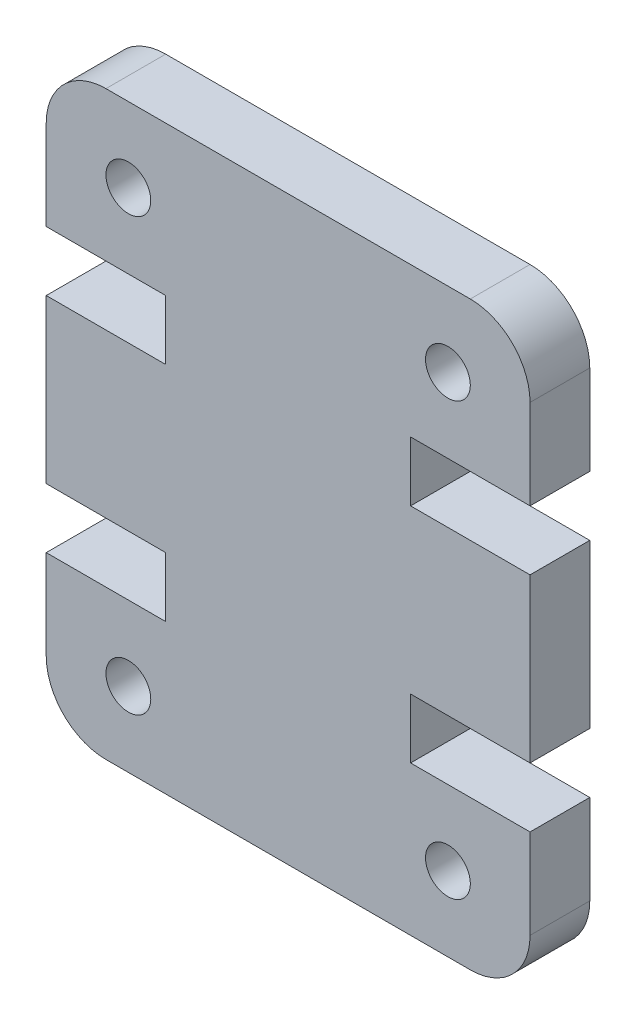
ISO-10303-21;
HEADER;
FILE_DESCRIPTION(('STEP AP214'),'2;1');
FILE_NAME('part.step','',(''),(''),'','','');
FILE_SCHEMA(('AUTOMOTIVE_DESIGN { 1 0 10303 214 1 1 1 1 }'));
ENDSEC;
DATA;
#1=APPLICATION_CONTEXT('core data for automotive mechanical design processes');
#2=APPLICATION_PROTOCOL_DEFINITION('international standard','automotive_design',2000,#1);
#3=PRODUCT_CONTEXT('',#1,'mechanical');
#4=PRODUCT('Part','Part','',(#3));
#5=PRODUCT_RELATED_PRODUCT_CATEGORY('part','',(#4));
#6=PRODUCT_DEFINITION_FORMATION('','',#4);
#7=PRODUCT_DEFINITION_CONTEXT('part definition',#1,'design');
#8=PRODUCT_DEFINITION('design','',#6,#7);
#9=PRODUCT_DEFINITION_SHAPE('','',#8);
#10=(LENGTH_UNIT() NAMED_UNIT(*) SI_UNIT(.MILLI.,.METRE.));
#11=(NAMED_UNIT(*) PLANE_ANGLE_UNIT() SI_UNIT($,.RADIAN.));
#12=(NAMED_UNIT(*) SI_UNIT($,.STERADIAN.) SOLID_ANGLE_UNIT());
#13=UNCERTAINTY_MEASURE_WITH_UNIT(LENGTH_MEASURE(1.E-05),#10,'distance_accuracy_value','');
#14=(GEOMETRIC_REPRESENTATION_CONTEXT(3) GLOBAL_UNCERTAINTY_ASSIGNED_CONTEXT((#13)) GLOBAL_UNIT_ASSIGNED_CONTEXT((#10,
#11,#12)) REPRESENTATION_CONTEXT('',''));
#15=CARTESIAN_POINT('',(0.,0.,0.));
#16=DIRECTION('',(0.,0.,1.));
#17=DIRECTION('',(1.,0.,0.));
#18=AXIS2_PLACEMENT_3D('',#15,#16,#17);
#19=CARTESIAN_POINT('',(14.1999999999999,2.00000000000013,2.));
#20=DIRECTION('',(0.,0.,-1.));
#21=DIRECTION('',(-1.,0.,0.));
#22=AXIS2_PLACEMENT_3D('',#19,#20,#21);
#23=PLANE('',#22);
#24=CARTESIAN_POINT('',(2.75000000000449,16.9549999999999,2.));
#25=DIRECTION('',(0.,0.,1.));
#26=DIRECTION('',(-1.,0.,0.));
#27=AXIS2_PLACEMENT_3D('',#24,#25,#26);
#28=CIRCLE('',#27,0.75);
#29=CARTESIAN_POINT('',(2.00000000000449,16.9549999999999,2.));
#30=VERTEX_POINT('',#29);
#31=EDGE_CURVE('E448',#30,#30,#28,.T.);
#32=ORIENTED_EDGE('',*,*,#31,.F.);
#33=EDGE_LOOP('',(#32));
#34=FACE_BOUND('',#33,.T.);
#35=CARTESIAN_POINT('',(13.4499999999955,2.50000000000005,2.));
#36=DIRECTION('',(0.,0.,1.));
#37=DIRECTION('',(-1.,0.,0.));
#38=AXIS2_PLACEMENT_3D('',#35,#36,#37);
#39=CIRCLE('',#38,0.750000000000004);
#40=CARTESIAN_POINT('',(12.6999999999955,2.50000000000005,2.));
#41=VERTEX_POINT('',#40);
#42=EDGE_CURVE('E230',#41,#41,#39,.T.);
#43=ORIENTED_EDGE('',*,*,#42,.F.);
#44=EDGE_LOOP('',(#43));
#45=FACE_BOUND('',#44,.T.);
#46=CARTESIAN_POINT('',(14.1999999999999,2.00000000000013,2.));
#47=DIRECTION('',(0.,0.,1.));
#48=DIRECTION('',(-1.,0.,0.));
#49=AXIS2_PLACEMENT_3D('',#46,#47,#48);
#50=CIRCLE('',#49,2.00000000000013);
#51=CARTESIAN_POINT('',(14.1999999999999,0.,2.));
#52=VERTEX_POINT('',#51);
#53=CARTESIAN_POINT('',(16.2,2.00000000000013,2.));
#54=VERTEX_POINT('',#53);
#55=EDGE_CURVE('E273',#52,#54,#50,.T.);
#56=ORIENTED_EDGE('',*,*,#55,.T.);
#57=DIRECTION('',(0.,1.,0.));
#58=VECTOR('',#57,1.);
#59=CARTESIAN_POINT('',(16.2,5.00000000000021,2.));
#60=LINE('',#59,#58);
#61=CARTESIAN_POINT('',(16.2,5.00000000000021,2.));
#62=VERTEX_POINT('',#61);
#63=EDGE_CURVE('E141',#54,#62,#60,.T.);
#64=ORIENTED_EDGE('',*,*,#63,.T.);
#65=DIRECTION('',(-1.,0.,0.));
#66=VECTOR('',#65,1.);
#67=CARTESIAN_POINT('',(12.1999999999997,5.00000000000021,2.));
#68=LINE('',#67,#66);
#69=CARTESIAN_POINT('',(12.1999999999997,5.00000000000021,2.));
#70=VERTEX_POINT('',#69);
#71=EDGE_CURVE('E336',#62,#70,#68,.T.);
#72=ORIENTED_EDGE('',*,*,#71,.T.);
#73=DIRECTION('',(0.,1.,0.));
#74=VECTOR('',#73,1.);
#75=CARTESIAN_POINT('',(12.1999999999997,7.00000000000034,2.));
#76=LINE('',#75,#74);
#77=CARTESIAN_POINT('',(12.1999999999997,7.00000000000034,2.));
#78=VERTEX_POINT('',#77);
#79=EDGE_CURVE('E355',#70,#78,#76,.T.);
#80=ORIENTED_EDGE('',*,*,#79,.T.);
#81=DIRECTION('',(1.,0.,0.));
#82=VECTOR('',#81,1.);
#83=CARTESIAN_POINT('',(16.2,7.00000000000034,2.));
#84=LINE('',#83,#82);
#85=CARTESIAN_POINT('',(16.2,7.00000000000034,2.));
#86=VERTEX_POINT('',#85);
#87=EDGE_CURVE('E352',#78,#86,#84,.T.);
#88=ORIENTED_EDGE('',*,*,#87,.T.);
#89=DIRECTION('',(0.,1.,0.));
#90=VECTOR('',#89,1.);
#91=CARTESIAN_POINT('',(16.2,7.00000000000034,2.));
#92=LINE('',#91,#90);
#93=CARTESIAN_POINT('',(16.2,12.4549999999997,2.));
#94=VERTEX_POINT('',#93);
#95=EDGE_CURVE('E354',#86,#94,#92,.T.);
#96=ORIENTED_EDGE('',*,*,#95,.T.);
#97=DIRECTION('',(-1.,0.,0.));
#98=VECTOR('',#97,1.);
#99=CARTESIAN_POINT('',(16.2,12.4549999999997,2.));
#100=LINE('',#99,#98);
#101=CARTESIAN_POINT('',(12.1999999999997,12.4549999999997,2.));
#102=VERTEX_POINT('',#101);
#103=EDGE_CURVE('E357',#94,#102,#100,.T.);
#104=ORIENTED_EDGE('',*,*,#103,.T.);
#105=DIRECTION('',(0.,1.,0.));
#106=VECTOR('',#105,1.);
#107=CARTESIAN_POINT('',(12.1999999999997,12.4549999999997,2.));
#108=LINE('',#107,#106);
#109=CARTESIAN_POINT('',(12.1999999999997,14.4549999999998,2.));
#110=VERTEX_POINT('',#109);
#111=EDGE_CURVE('E363',#102,#110,#108,.T.);
#112=ORIENTED_EDGE('',*,*,#111,.T.);
#113=DIRECTION('',(1.,0.,0.));
#114=VECTOR('',#113,1.);
#115=CARTESIAN_POINT('',(12.1999999999997,14.4549999999998,2.));
#116=LINE('',#115,#114);
#117=CARTESIAN_POINT('',(16.2,14.4549999999998,2.));
#118=VERTEX_POINT('',#117);
#119=EDGE_CURVE('E365',#110,#118,#116,.T.);
#120=ORIENTED_EDGE('',*,*,#119,.T.);
#121=DIRECTION('',(0.,1.,0.));
#122=VECTOR('',#121,1.);
#123=CARTESIAN_POINT('',(16.2,14.4549999999998,2.));
#124=LINE('',#123,#122);
#125=CARTESIAN_POINT('',(16.2,17.4549999999999,2.));
#126=VERTEX_POINT('',#125);
#127=EDGE_CURVE('E367',#118,#126,#124,.T.);
#128=ORIENTED_EDGE('',*,*,#127,.T.);
#129=CARTESIAN_POINT('',(14.1999999999999,17.4549999999999,2.));
#130=DIRECTION('',(0.,0.,1.));
#131=DIRECTION('',(1.,0.,0.));
#132=AXIS2_PLACEMENT_3D('',#129,#130,#131);
#133=CIRCLE('',#132,2.00000000000013);
#134=CARTESIAN_POINT('',(14.1999999999999,19.455,2.));
#135=VERTEX_POINT('',#134);
#136=EDGE_CURVE('E369',#126,#135,#133,.T.);
#137=ORIENTED_EDGE('',*,*,#136,.T.);
#138=DIRECTION('',(-1.,0.,0.));
#139=VECTOR('',#138,1.);
#140=CARTESIAN_POINT('',(2.00000000000012,19.455,2.));
#141=LINE('',#140,#139);
#142=CARTESIAN_POINT('',(2.00000000000012,19.455,2.));
#143=VERTEX_POINT('',#142);
#144=EDGE_CURVE('E371',#135,#143,#141,.T.);
#145=ORIENTED_EDGE('',*,*,#144,.T.);
#146=CARTESIAN_POINT('',(2.00000000000012,17.4549999999999,2.));
#147=DIRECTION('',(0.,0.,1.));
#148=DIRECTION('',(-1.,0.,0.));
#149=AXIS2_PLACEMENT_3D('',#146,#147,#148);
#150=CIRCLE('',#149,2.00000000000013);
#151=CARTESIAN_POINT('',(0.,17.4549999999999,2.));
#152=VERTEX_POINT('',#151);
#153=EDGE_CURVE('E373',#143,#152,#150,.T.);
#154=ORIENTED_EDGE('',*,*,#153,.T.);
#155=DIRECTION('',(0.,-1.,0.));
#156=VECTOR('',#155,1.);
#157=CARTESIAN_POINT('',(0.,14.4549999999998,2.));
#158=LINE('',#157,#156);
#159=CARTESIAN_POINT('',(0.,14.4549999999998,2.));
#160=VERTEX_POINT('',#159);
#161=EDGE_CURVE('E375',#152,#160,#158,.T.);
#162=ORIENTED_EDGE('',*,*,#161,.T.);
#163=DIRECTION('',(1.,0.,0.));
#164=VECTOR('',#163,1.);
#165=CARTESIAN_POINT('',(4.00000000000025,14.4549999999998,2.));
#166=LINE('',#165,#164);
#167=CARTESIAN_POINT('',(4.00000000000025,14.4549999999998,2.));
#168=VERTEX_POINT('',#167);
#169=EDGE_CURVE('E377',#160,#168,#166,.T.);
#170=ORIENTED_EDGE('',*,*,#169,.T.);
#171=DIRECTION('',(0.,-1.,0.));
#172=VECTOR('',#171,1.);
#173=CARTESIAN_POINT('',(4.00000000000025,12.4549999999997,2.));
#174=LINE('',#173,#172);
#175=CARTESIAN_POINT('',(4.00000000000025,12.4549999999997,2.));
#176=VERTEX_POINT('',#175);
#177=EDGE_CURVE('E379',#168,#176,#174,.T.);
#178=ORIENTED_EDGE('',*,*,#177,.T.);
#179=DIRECTION('',(-1.,0.,0.));
#180=VECTOR('',#179,1.);
#181=CARTESIAN_POINT('',(0.,12.4549999999997,2.));
#182=LINE('',#181,#180);
#183=CARTESIAN_POINT('',(0.,12.4549999999997,2.));
#184=VERTEX_POINT('',#183);
#185=EDGE_CURVE('E381',#176,#184,#182,.T.);
#186=ORIENTED_EDGE('',*,*,#185,.T.);
#187=DIRECTION('',(0.,-1.,0.));
#188=VECTOR('',#187,1.);
#189=CARTESIAN_POINT('',(0.,7.00000000000034,2.));
#190=LINE('',#189,#188);
#191=CARTESIAN_POINT('',(0.,7.00000000000034,2.));
#192=VERTEX_POINT('',#191);
#193=EDGE_CURVE('E383',#184,#192,#190,.T.);
#194=ORIENTED_EDGE('',*,*,#193,.T.);
#195=DIRECTION('',(1.,0.,0.));
#196=VECTOR('',#195,1.);
#197=CARTESIAN_POINT('',(0.,7.00000000000034,2.));
#198=LINE('',#197,#196);
#199=CARTESIAN_POINT('',(4.00000000000016,7.00000000000031,2.));
#200=VERTEX_POINT('',#199);
#201=EDGE_CURVE('E385',#192,#200,#198,.T.);
#202=ORIENTED_EDGE('',*,*,#201,.T.);
#203=DIRECTION('',(0.,-1.,0.));
#204=VECTOR('',#203,1.);
#205=CARTESIAN_POINT('',(4.00000000000016,7.00000000000031,2.));
#206=LINE('',#205,#204);
#207=CARTESIAN_POINT('',(4.00000000000016,5.00000000000021,2.));
#208=VERTEX_POINT('',#207);
#209=EDGE_CURVE('E387',#200,#208,#206,.T.);
#210=ORIENTED_EDGE('',*,*,#209,.T.);
#211=DIRECTION('',(-1.,0.,0.));
#212=VECTOR('',#211,1.);
#213=CARTESIAN_POINT('',(4.00000000000016,5.00000000000021,2.));
#214=LINE('',#213,#212);
#215=CARTESIAN_POINT('',(0.,5.00000000000021,2.));
#216=VERTEX_POINT('',#215);
#217=EDGE_CURVE('E208',#208,#216,#214,.T.);
#218=ORIENTED_EDGE('',*,*,#217,.T.);
#219=DIRECTION('',(0.,-1.,0.));
#220=VECTOR('',#219,1.);
#221=CARTESIAN_POINT('',(0.,5.00000000000021,2.));
#222=LINE('',#221,#220);
#223=CARTESIAN_POINT('',(0.,2.0000000000001,2.));
#224=VERTEX_POINT('',#223);
#225=EDGE_CURVE('E202',#216,#224,#222,.T.);
#226=ORIENTED_EDGE('',*,*,#225,.T.);
#227=CARTESIAN_POINT('',(2.00000000000007,2.00000000000013,2.));
#228=DIRECTION('',(0.,0.,1.));
#229=DIRECTION('',(1.,0.,0.));
#230=AXIS2_PLACEMENT_3D('',#227,#228,#229);
#231=CIRCLE('',#230,2.0000000000001);
#232=CARTESIAN_POINT('',(2.00000000000008,0.,2.));
#233=VERTEX_POINT('',#232);
#234=EDGE_CURVE('E206',#224,#233,#231,.T.);
#235=ORIENTED_EDGE('',*,*,#234,.T.);
#236=DIRECTION('',(1.,0.,0.));
#237=VECTOR('',#236,1.);
#238=CARTESIAN_POINT('',(2.00000000000008,0.,2.));
#239=LINE('',#238,#237);
#240=EDGE_CURVE('E50',#233,#52,#239,.T.);
#241=ORIENTED_EDGE('',*,*,#240,.T.);
#242=EDGE_LOOP('',(#56,#64,#72,#80,#88,#96,#104,#112,#120,#128,#137,#145,#154,#162,#170,#178,
#186,#194,#202,#210,#218,#226,#235,#241));
#243=FACE_BOUND('',#242,.T.);
#244=CARTESIAN_POINT('',(2.7500000000045,2.50000000000004,2.));
#245=DIRECTION('',(0.,0.,1.));
#246=DIRECTION('',(1.,0.,0.));
#247=AXIS2_PLACEMENT_3D('',#244,#245,#246);
#248=CIRCLE('',#247,0.75);
#249=CARTESIAN_POINT('',(3.5000000000045,2.50000000000004,2.));
#250=VERTEX_POINT('',#249);
#251=EDGE_CURVE('E454',#250,#250,#248,.T.);
#252=ORIENTED_EDGE('',*,*,#251,.F.);
#253=EDGE_LOOP('',(#252));
#254=FACE_BOUND('',#253,.T.);
#255=CARTESIAN_POINT('',(13.4499999999955,16.9549999999999,2.));
#256=DIRECTION('',(0.,0.,1.));
#257=DIRECTION('',(1.,0.,0.));
#258=AXIS2_PLACEMENT_3D('',#255,#256,#257);
#259=CIRCLE('',#258,0.750000000000004);
#260=CARTESIAN_POINT('',(14.1999999999955,16.9549999999999,2.));
#261=VERTEX_POINT('',#260);
#262=EDGE_CURVE('E439',#261,#261,#259,.T.);
#263=ORIENTED_EDGE('',*,*,#262,.F.);
#264=EDGE_LOOP('',(#263));
#265=FACE_BOUND('',#264,.T.);
#266=ADVANCED_FACE('F33',(#34,#45,#243,#254,#265),#23,.F.);
#267=CARTESIAN_POINT('',(14.1999999999999,2.00000000000013,0.));
#268=DIRECTION('',(0.,0.,-1.));
#269=DIRECTION('',(-1.,0.,0.));
#270=AXIS2_PLACEMENT_3D('',#267,#268,#269);
#271=PLANE('',#270);
#272=CARTESIAN_POINT('',(2.75000000000449,16.9549999999999,0.));
#273=DIRECTION('',(0.,0.,1.));
#274=DIRECTION('',(-1.,0.,0.));
#275=AXIS2_PLACEMENT_3D('',#272,#273,#274);
#276=CIRCLE('',#275,0.75);
#277=CARTESIAN_POINT('',(2.00000000000449,16.9549999999999,0.));
#278=VERTEX_POINT('',#277);
#279=EDGE_CURVE('E445',#278,#278,#276,.T.);
#280=ORIENTED_EDGE('',*,*,#279,.T.);
#281=EDGE_LOOP('',(#280));
#282=FACE_BOUND('',#281,.T.);
#283=CARTESIAN_POINT('',(13.4499999999955,2.50000000000005,0.));
#284=DIRECTION('',(0.,0.,1.));
#285=DIRECTION('',(-1.,0.,0.));
#286=AXIS2_PLACEMENT_3D('',#283,#284,#285);
#287=CIRCLE('',#286,0.750000000000004);
#288=CARTESIAN_POINT('',(12.6999999999955,2.50000000000005,0.));
#289=VERTEX_POINT('',#288);
#290=EDGE_CURVE('E457',#289,#289,#287,.T.);
#291=ORIENTED_EDGE('',*,*,#290,.T.);
#292=EDGE_LOOP('',(#291));
#293=FACE_BOUND('',#292,.T.);
#294=CARTESIAN_POINT('',(14.1999999999999,2.00000000000013,0.));
#295=DIRECTION('',(0.,0.,1.));
#296=DIRECTION('',(-1.,0.,0.));
#297=AXIS2_PLACEMENT_3D('',#294,#295,#296);
#298=CIRCLE('',#297,2.00000000000013);
#299=CARTESIAN_POINT('',(14.1999999999999,0.,0.));
#300=VERTEX_POINT('',#299);
#301=CARTESIAN_POINT('',(16.2,2.00000000000013,0.));
#302=VERTEX_POINT('',#301);
#303=EDGE_CURVE('E226',#300,#302,#298,.T.);
#304=ORIENTED_EDGE('',*,*,#303,.F.);
#305=DIRECTION('',(1.,0.,0.));
#306=VECTOR('',#305,1.);
#307=CARTESIAN_POINT('',(2.00000000000008,0.,0.));
#308=LINE('',#307,#306);
#309=CARTESIAN_POINT('',(2.00000000000008,0.,0.));
#310=VERTEX_POINT('',#309);
#311=EDGE_CURVE('E133',#310,#300,#308,.T.);
#312=ORIENTED_EDGE('',*,*,#311,.F.);
#313=CARTESIAN_POINT('',(2.00000000000007,2.00000000000013,0.));
#314=DIRECTION('',(0.,0.,1.));
#315=DIRECTION('',(1.,0.,0.));
#316=AXIS2_PLACEMENT_3D('',#313,#314,#315);
#317=CIRCLE('',#316,2.0000000000001);
#318=CARTESIAN_POINT('',(0.,2.0000000000001,0.));
#319=VERTEX_POINT('',#318);
#320=EDGE_CURVE('E127',#319,#310,#317,.T.);
#321=ORIENTED_EDGE('',*,*,#320,.F.);
#322=DIRECTION('',(0.,-1.,0.));
#323=VECTOR('',#322,1.);
#324=CARTESIAN_POINT('',(0.,5.00000000000021,0.));
#325=LINE('',#324,#323);
#326=CARTESIAN_POINT('',(0.,5.00000000000021,0.));
#327=VERTEX_POINT('',#326);
#328=EDGE_CURVE('E216',#327,#319,#325,.T.);
#329=ORIENTED_EDGE('',*,*,#328,.F.);
#330=DIRECTION('',(-1.,0.,0.));
#331=VECTOR('',#330,1.);
#332=CARTESIAN_POINT('',(4.00000000000016,5.00000000000021,0.));
#333=LINE('',#332,#331);
#334=CARTESIAN_POINT('',(4.00000000000016,5.00000000000021,0.));
#335=VERTEX_POINT('',#334);
#336=EDGE_CURVE('E268',#335,#327,#333,.T.);
#337=ORIENTED_EDGE('',*,*,#336,.F.);
#338=DIRECTION('',(0.,-1.,0.));
#339=VECTOR('',#338,1.);
#340=CARTESIAN_POINT('',(4.00000000000016,7.00000000000031,0.));
#341=LINE('',#340,#339);
#342=CARTESIAN_POINT('',(4.00000000000016,7.00000000000031,0.));
#343=VERTEX_POINT('',#342);
#344=EDGE_CURVE('E266',#343,#335,#341,.T.);
#345=ORIENTED_EDGE('',*,*,#344,.F.);
#346=DIRECTION('',(1.,0.,0.));
#347=VECTOR('',#346,1.);
#348=CARTESIAN_POINT('',(0.,7.00000000000034,0.));
#349=LINE('',#348,#347);
#350=CARTESIAN_POINT('',(0.,7.00000000000034,0.));
#351=VERTEX_POINT('',#350);
#352=EDGE_CURVE('E264',#351,#343,#349,.T.);
#353=ORIENTED_EDGE('',*,*,#352,.F.);
#354=DIRECTION('',(0.,-1.,0.));
#355=VECTOR('',#354,1.);
#356=CARTESIAN_POINT('',(0.,7.00000000000034,0.));
#357=LINE('',#356,#355);
#358=CARTESIAN_POINT('',(0.,12.4549999999997,0.));
#359=VERTEX_POINT('',#358);
#360=EDGE_CURVE('E262',#359,#351,#357,.T.);
#361=ORIENTED_EDGE('',*,*,#360,.F.);
#362=DIRECTION('',(-1.,0.,0.));
#363=VECTOR('',#362,1.);
#364=CARTESIAN_POINT('',(0.,12.4549999999997,0.));
#365=LINE('',#364,#363);
#366=CARTESIAN_POINT('',(4.00000000000025,12.4549999999997,0.));
#367=VERTEX_POINT('',#366);
#368=EDGE_CURVE('E260',#367,#359,#365,.T.);
#369=ORIENTED_EDGE('',*,*,#368,.F.);
#370=DIRECTION('',(0.,-1.,0.));
#371=VECTOR('',#370,1.);
#372=CARTESIAN_POINT('',(4.00000000000025,12.4549999999997,0.));
#373=LINE('',#372,#371);
#374=CARTESIAN_POINT('',(4.00000000000025,14.4549999999998,0.));
#375=VERTEX_POINT('',#374);
#376=EDGE_CURVE('E258',#375,#367,#373,.T.);
#377=ORIENTED_EDGE('',*,*,#376,.F.);
#378=DIRECTION('',(1.,0.,0.));
#379=VECTOR('',#378,1.);
#380=CARTESIAN_POINT('',(4.00000000000025,14.4549999999998,0.));
#381=LINE('',#380,#379);
#382=CARTESIAN_POINT('',(0.,14.4549999999998,0.));
#383=VERTEX_POINT('',#382);
#384=EDGE_CURVE('E256',#383,#375,#381,.T.);
#385=ORIENTED_EDGE('',*,*,#384,.F.);
#386=DIRECTION('',(0.,-1.,0.));
#387=VECTOR('',#386,1.);
#388=CARTESIAN_POINT('',(0.,14.4549999999998,0.));
#389=LINE('',#388,#387);
#390=CARTESIAN_POINT('',(0.,17.4549999999999,0.));
#391=VERTEX_POINT('',#390);
#392=EDGE_CURVE('E254',#391,#383,#389,.T.);
#393=ORIENTED_EDGE('',*,*,#392,.F.);
#394=CARTESIAN_POINT('',(2.00000000000012,17.4549999999999,0.));
#395=DIRECTION('',(0.,0.,1.));
#396=DIRECTION('',(-1.,0.,0.));
#397=AXIS2_PLACEMENT_3D('',#394,#395,#396);
#398=CIRCLE('',#397,2.00000000000013);
#399=CARTESIAN_POINT('',(2.00000000000012,19.455,0.));
#400=VERTEX_POINT('',#399);
#401=EDGE_CURVE('E252',#400,#391,#398,.T.);
#402=ORIENTED_EDGE('',*,*,#401,.F.);
#403=DIRECTION('',(-1.,0.,0.));
#404=VECTOR('',#403,1.);
#405=CARTESIAN_POINT('',(2.00000000000012,19.455,0.));
#406=LINE('',#405,#404);
#407=CARTESIAN_POINT('',(14.1999999999999,19.455,0.));
#408=VERTEX_POINT('',#407);
#409=EDGE_CURVE('E250',#408,#400,#406,.T.);
#410=ORIENTED_EDGE('',*,*,#409,.F.);
#411=CARTESIAN_POINT('',(14.1999999999999,17.4549999999999,0.));
#412=DIRECTION('',(0.,0.,1.));
#413=DIRECTION('',(1.,0.,0.));
#414=AXIS2_PLACEMENT_3D('',#411,#412,#413);
#415=CIRCLE('',#414,2.00000000000013);
#416=CARTESIAN_POINT('',(16.2,17.4549999999999,0.));
#417=VERTEX_POINT('',#416);
#418=EDGE_CURVE('E248',#417,#408,#415,.T.);
#419=ORIENTED_EDGE('',*,*,#418,.F.);
#420=DIRECTION('',(0.,1.,0.));
#421=VECTOR('',#420,1.);
#422=CARTESIAN_POINT('',(16.2,14.4549999999998,0.));
#423=LINE('',#422,#421);
#424=CARTESIAN_POINT('',(16.2,14.4549999999998,0.));
#425=VERTEX_POINT('',#424);
#426=EDGE_CURVE('E246',#425,#417,#423,.T.);
#427=ORIENTED_EDGE('',*,*,#426,.F.);
#428=DIRECTION('',(1.,0.,0.));
#429=VECTOR('',#428,1.);
#430=CARTESIAN_POINT('',(12.1999999999997,14.4549999999998,0.));
#431=LINE('',#430,#429);
#432=CARTESIAN_POINT('',(12.1999999999997,14.4549999999998,0.));
#433=VERTEX_POINT('',#432);
#434=EDGE_CURVE('E244',#433,#425,#431,.T.);
#435=ORIENTED_EDGE('',*,*,#434,.F.);
#436=DIRECTION('',(0.,1.,0.));
#437=VECTOR('',#436,1.);
#438=CARTESIAN_POINT('',(12.1999999999997,12.4549999999997,0.));
#439=LINE('',#438,#437);
#440=CARTESIAN_POINT('',(12.1999999999997,12.4549999999997,0.));
#441=VERTEX_POINT('',#440);
#442=EDGE_CURVE('E242',#441,#433,#439,.T.);
#443=ORIENTED_EDGE('',*,*,#442,.F.);
#444=DIRECTION('',(-1.,0.,0.));
#445=VECTOR('',#444,1.);
#446=CARTESIAN_POINT('',(16.2,12.4549999999997,0.));
#447=LINE('',#446,#445);
#448=CARTESIAN_POINT('',(16.2,12.4549999999997,0.));
#449=VERTEX_POINT('',#448);
#450=EDGE_CURVE('E240',#449,#441,#447,.T.);
#451=ORIENTED_EDGE('',*,*,#450,.F.);
#452=DIRECTION('',(0.,1.,0.));
#453=VECTOR('',#452,1.);
#454=CARTESIAN_POINT('',(16.2,7.00000000000034,0.));
#455=LINE('',#454,#453);
#456=CARTESIAN_POINT('',(16.2,7.00000000000034,0.));
#457=VERTEX_POINT('',#456);
#458=EDGE_CURVE('E238',#457,#449,#455,.T.);
#459=ORIENTED_EDGE('',*,*,#458,.F.);
#460=DIRECTION('',(1.,0.,0.));
#461=VECTOR('',#460,1.);
#462=CARTESIAN_POINT('',(16.2,7.00000000000034,0.));
#463=LINE('',#462,#461);
#464=CARTESIAN_POINT('',(12.1999999999997,7.00000000000034,0.));
#465=VERTEX_POINT('',#464);
#466=EDGE_CURVE('E236',#465,#457,#463,.T.);
#467=ORIENTED_EDGE('',*,*,#466,.F.);
#468=DIRECTION('',(0.,1.,0.));
#469=VECTOR('',#468,1.);
#470=CARTESIAN_POINT('',(12.1999999999997,7.00000000000034,0.));
#471=LINE('',#470,#469);
#472=CARTESIAN_POINT('',(12.1999999999997,5.00000000000021,0.));
#473=VERTEX_POINT('',#472);
#474=EDGE_CURVE('E234',#473,#465,#471,.T.);
#475=ORIENTED_EDGE('',*,*,#474,.F.);
#476=DIRECTION('',(-1.,0.,0.));
#477=VECTOR('',#476,1.);
#478=CARTESIAN_POINT('',(12.1999999999997,5.00000000000021,0.));
#479=LINE('',#478,#477);
#480=CARTESIAN_POINT('',(16.2,5.00000000000021,0.));
#481=VERTEX_POINT('',#480);
#482=EDGE_CURVE('E232',#481,#473,#479,.T.);
#483=ORIENTED_EDGE('',*,*,#482,.F.);
#484=DIRECTION('',(0.,1.,0.));
#485=VECTOR('',#484,1.);
#486=CARTESIAN_POINT('',(16.2,5.00000000000021,0.));
#487=LINE('',#486,#485);
#488=EDGE_CURVE('E229',#302,#481,#487,.T.);
#489=ORIENTED_EDGE('',*,*,#488,.F.);
#490=EDGE_LOOP('',(#304,#312,#321,#329,#337,#345,#353,#361,#369,#377,#385,#393,#402,#410,#419,
#427,#435,#443,#451,#459,#467,#475,#483,#489));
#491=FACE_BOUND('',#490,.T.);
#492=CARTESIAN_POINT('',(2.7500000000045,2.50000000000004,0.));
#493=DIRECTION('',(0.,0.,1.));
#494=DIRECTION('',(1.,0.,0.));
#495=AXIS2_PLACEMENT_3D('',#492,#493,#494);
#496=CIRCLE('',#495,0.75);
#497=CARTESIAN_POINT('',(3.5000000000045,2.50000000000004,0.));
#498=VERTEX_POINT('',#497);
#499=EDGE_CURVE('E451',#498,#498,#496,.T.);
#500=ORIENTED_EDGE('',*,*,#499,.T.);
#501=EDGE_LOOP('',(#500));
#502=FACE_BOUND('',#501,.T.);
#503=CARTESIAN_POINT('',(13.4499999999955,16.9549999999999,0.));
#504=DIRECTION('',(0.,0.,1.));
#505=DIRECTION('',(1.,0.,0.));
#506=AXIS2_PLACEMENT_3D('',#503,#504,#505);
#507=CIRCLE('',#506,0.750000000000004);
#508=CARTESIAN_POINT('',(14.1999999999955,16.9549999999999,0.));
#509=VERTEX_POINT('',#508);
#510=EDGE_CURVE('E442',#509,#509,#507,.T.);
#511=ORIENTED_EDGE('',*,*,#510,.T.);
#512=EDGE_LOOP('',(#511));
#513=FACE_BOUND('',#512,.T.);
#514=ADVANCED_FACE('F340',(#282,#293,#491,#502,#513),#271,.T.);
#515=CARTESIAN_POINT('',(14.1999999999999,2.00000000000013,2.));
#516=DIRECTION('',(0.,0.,-1.));
#517=DIRECTION('',(-1.,0.,0.));
#518=AXIS2_PLACEMENT_3D('',#515,#516,#517);
#519=CYLINDRICAL_SURFACE('',#518,2.00000000000013);
#520=ORIENTED_EDGE('',*,*,#303,.T.);
#521=DIRECTION('',(0.,0.,-1.));
#522=VECTOR('',#521,1.);
#523=CARTESIAN_POINT('',(16.2,2.00000000000013,2.));
#524=LINE('',#523,#522);
#525=EDGE_CURVE('E11',#54,#302,#524,.T.);
#526=ORIENTED_EDGE('',*,*,#525,.F.);
#527=ORIENTED_EDGE('',*,*,#55,.F.);
#528=DIRECTION('',(0.,0.,-1.));
#529=VECTOR('',#528,1.);
#530=CARTESIAN_POINT('',(14.1999999999999,0.,2.));
#531=LINE('',#530,#529);
#532=EDGE_CURVE('E222',#52,#300,#531,.T.);
#533=ORIENTED_EDGE('',*,*,#532,.T.);
#534=EDGE_LOOP('',(#520,#526,#527,#533));
#535=FACE_BOUND('',#534,.T.);
#536=ADVANCED_FACE('F35',(#535),#519,.T.);
#537=CARTESIAN_POINT('',(16.2,5.00000000000021,2.));
#538=DIRECTION('',(-1.,0.,0.));
#539=DIRECTION('',(0.,0.,1.));
#540=AXIS2_PLACEMENT_3D('',#537,#538,#539);
#541=PLANE('',#540);
#542=ORIENTED_EDGE('',*,*,#488,.T.);
#543=DIRECTION('',(0.,0.,-1.));
#544=VECTOR('',#543,1.);
#545=CARTESIAN_POINT('',(16.2,5.00000000000021,2.));
#546=LINE('',#545,#544);
#547=EDGE_CURVE('E42',#62,#481,#546,.T.);
#548=ORIENTED_EDGE('',*,*,#547,.F.);
#549=ORIENTED_EDGE('',*,*,#63,.F.);
#550=ORIENTED_EDGE('',*,*,#525,.T.);
#551=EDGE_LOOP('',(#542,#548,#549,#550));
#552=FACE_BOUND('',#551,.T.);
#553=ADVANCED_FACE('F686',(#552),#541,.F.);
#554=CARTESIAN_POINT('',(12.1999999999997,5.00000000000021,2.));
#555=DIRECTION('',(0.,-1.,0.));
#556=DIRECTION('',(0.,0.,-1.));
#557=AXIS2_PLACEMENT_3D('',#554,#555,#556);
#558=PLANE('',#557);
#559=ORIENTED_EDGE('',*,*,#482,.T.);
#560=DIRECTION('',(0.,0.,-1.));
#561=VECTOR('',#560,1.);
#562=CARTESIAN_POINT('',(12.1999999999997,5.00000000000021,2.));
#563=LINE('',#562,#561);
#564=EDGE_CURVE('E328',#70,#473,#563,.T.);
#565=ORIENTED_EDGE('',*,*,#564,.F.);
#566=ORIENTED_EDGE('',*,*,#71,.F.);
#567=ORIENTED_EDGE('',*,*,#547,.T.);
#568=EDGE_LOOP('',(#559,#565,#566,#567));
#569=FACE_BOUND('',#568,.T.);
#570=ADVANCED_FACE('F334',(#569),#558,.F.);
#571=CARTESIAN_POINT('',(12.1999999999997,7.00000000000034,2.));
#572=DIRECTION('',(-1.,0.,0.));
#573=DIRECTION('',(0.,-1.,0.));
#574=AXIS2_PLACEMENT_3D('',#571,#572,#573);
#575=PLANE('',#574);
#576=ORIENTED_EDGE('',*,*,#474,.T.);
#577=DIRECTION('',(0.,0.,-1.));
#578=VECTOR('',#577,1.);
#579=CARTESIAN_POINT('',(12.1999999999997,7.00000000000034,2.));
#580=LINE('',#579,#578);
#581=EDGE_CURVE('E325',#78,#465,#580,.T.);
#582=ORIENTED_EDGE('',*,*,#581,.F.);
#583=ORIENTED_EDGE('',*,*,#79,.F.);
#584=ORIENTED_EDGE('',*,*,#564,.T.);
#585=EDGE_LOOP('',(#576,#582,#583,#584));
#586=FACE_BOUND('',#585,.T.);
#587=ADVANCED_FACE('F346',(#586),#575,.F.);
#588=CARTESIAN_POINT('',(16.2,7.00000000000034,2.));
#589=DIRECTION('',(0.,1.,0.));
#590=DIRECTION('',(-1.,0.,0.));
#591=AXIS2_PLACEMENT_3D('',#588,#589,#590);
#592=PLANE('',#591);
#593=ORIENTED_EDGE('',*,*,#466,.T.);
#594=DIRECTION('',(0.,0.,-1.));
#595=VECTOR('',#594,1.);
#596=CARTESIAN_POINT('',(16.2,7.00000000000034,2.));
#597=LINE('',#596,#595);
#598=EDGE_CURVE('E322',#86,#457,#597,.T.);
#599=ORIENTED_EDGE('',*,*,#598,.F.);
#600=ORIENTED_EDGE('',*,*,#87,.F.);
#601=ORIENTED_EDGE('',*,*,#581,.T.);
#602=EDGE_LOOP('',(#593,#599,#600,#601));
#603=FACE_BOUND('',#602,.T.);
#604=ADVANCED_FACE('F350',(#603),#592,.F.);
#605=CARTESIAN_POINT('',(16.2,7.00000000000034,2.));
#606=DIRECTION('',(-1.,0.,0.));
#607=DIRECTION('',(0.,0.,1.));
#608=AXIS2_PLACEMENT_3D('',#605,#606,#607);
#609=PLANE('',#608);
#610=ORIENTED_EDGE('',*,*,#458,.T.);
#611=DIRECTION('',(0.,0.,-1.));
#612=VECTOR('',#611,1.);
#613=CARTESIAN_POINT('',(16.2,12.4549999999997,2.));
#614=LINE('',#613,#612);
#615=EDGE_CURVE('E319',#94,#449,#614,.T.);
#616=ORIENTED_EDGE('',*,*,#615,.F.);
#617=ORIENTED_EDGE('',*,*,#95,.F.);
#618=ORIENTED_EDGE('',*,*,#598,.T.);
#619=EDGE_LOOP('',(#610,#616,#617,#618));
#620=FACE_BOUND('',#619,.T.);
#621=ADVANCED_FACE('F651',(#620),#609,.F.);
#622=CARTESIAN_POINT('',(16.2,12.4549999999997,2.));
#623=DIRECTION('',(0.,-1.,0.));
#624=DIRECTION('',(1.,0.,0.));
#625=AXIS2_PLACEMENT_3D('',#622,#623,#624);
#626=PLANE('',#625);
#627=ORIENTED_EDGE('',*,*,#450,.T.);
#628=DIRECTION('',(0.,0.,-1.));
#629=VECTOR('',#628,1.);
#630=CARTESIAN_POINT('',(12.1999999999997,12.4549999999997,2.));
#631=LINE('',#630,#629);
#632=EDGE_CURVE('E316',#102,#441,#631,.T.);
#633=ORIENTED_EDGE('',*,*,#632,.F.);
#634=ORIENTED_EDGE('',*,*,#103,.F.);
#635=ORIENTED_EDGE('',*,*,#615,.T.);
#636=EDGE_LOOP('',(#627,#633,#634,#635));
#637=FACE_BOUND('',#636,.T.);
#638=ADVANCED_FACE('F641',(#637),#626,.F.);
#639=CARTESIAN_POINT('',(12.1999999999997,12.4549999999997,2.));
#640=DIRECTION('',(-1.,0.,0.));
#641=DIRECTION('',(0.,-1.,0.));
#642=AXIS2_PLACEMENT_3D('',#639,#640,#641);
#643=PLANE('',#642);
#644=ORIENTED_EDGE('',*,*,#442,.T.);
#645=DIRECTION('',(0.,0.,-1.));
#646=VECTOR('',#645,1.);
#647=CARTESIAN_POINT('',(12.1999999999997,14.4549999999998,2.));
#648=LINE('',#647,#646);
#649=EDGE_CURVE('E313',#110,#433,#648,.T.);
#650=ORIENTED_EDGE('',*,*,#649,.F.);
#651=ORIENTED_EDGE('',*,*,#111,.F.);
#652=ORIENTED_EDGE('',*,*,#632,.T.);
#653=EDGE_LOOP('',(#644,#650,#651,#652));
#654=FACE_BOUND('',#653,.T.);
#655=ADVANCED_FACE('F631',(#654),#643,.F.);
#656=CARTESIAN_POINT('',(12.1999999999997,14.4549999999998,2.));
#657=DIRECTION('',(0.,1.,0.));
#658=DIRECTION('',(0.,0.,1.));
#659=AXIS2_PLACEMENT_3D('',#656,#657,#658);
#660=PLANE('',#659);
#661=ORIENTED_EDGE('',*,*,#434,.T.);
#662=DIRECTION('',(0.,0.,-1.));
#663=VECTOR('',#662,1.);
#664=CARTESIAN_POINT('',(16.2,14.4549999999998,2.));
#665=LINE('',#664,#663);
#666=EDGE_CURVE('E310',#118,#425,#665,.T.);
#667=ORIENTED_EDGE('',*,*,#666,.F.);
#668=ORIENTED_EDGE('',*,*,#119,.F.);
#669=ORIENTED_EDGE('',*,*,#649,.T.);
#670=EDGE_LOOP('',(#661,#667,#668,#669));
#671=FACE_BOUND('',#670,.T.);
#672=ADVANCED_FACE('F621',(#671),#660,.F.);
#673=CARTESIAN_POINT('',(16.2,14.4549999999998,2.));
#674=DIRECTION('',(-1.,0.,0.));
#675=DIRECTION('',(0.,0.,1.));
#676=AXIS2_PLACEMENT_3D('',#673,#674,#675);
#677=PLANE('',#676);
#678=ORIENTED_EDGE('',*,*,#426,.T.);
#679=DIRECTION('',(0.,0.,-1.));
#680=VECTOR('',#679,1.);
#681=CARTESIAN_POINT('',(16.2,17.4549999999999,2.));
#682=LINE('',#681,#680);
#683=EDGE_CURVE('E307',#126,#417,#682,.T.);
#684=ORIENTED_EDGE('',*,*,#683,.F.);
#685=ORIENTED_EDGE('',*,*,#127,.F.);
#686=ORIENTED_EDGE('',*,*,#666,.T.);
#687=EDGE_LOOP('',(#678,#684,#685,#686));
#688=FACE_BOUND('',#687,.T.);
#689=ADVANCED_FACE('F611',(#688),#677,.F.);
#690=CARTESIAN_POINT('',(14.1999999999999,17.4549999999999,2.));
#691=DIRECTION('',(0.,0.,-1.));
#692=DIRECTION('',(-1.,0.,0.));
#693=AXIS2_PLACEMENT_3D('',#690,#691,#692);
#694=CYLINDRICAL_SURFACE('',#693,2.00000000000013);
#695=ORIENTED_EDGE('',*,*,#418,.T.);
#696=DIRECTION('',(0.,0.,-1.));
#697=VECTOR('',#696,1.);
#698=CARTESIAN_POINT('',(14.1999999999999,19.455,2.));
#699=LINE('',#698,#697);
#700=EDGE_CURVE('E304',#135,#408,#699,.T.);
#701=ORIENTED_EDGE('',*,*,#700,.F.);
#702=ORIENTED_EDGE('',*,*,#136,.F.);
#703=ORIENTED_EDGE('',*,*,#683,.T.);
#704=EDGE_LOOP('',(#695,#701,#702,#703));
#705=FACE_BOUND('',#704,.T.);
#706=ADVANCED_FACE('F601',(#705),#694,.T.);
#707=CARTESIAN_POINT('',(2.00000000000012,19.455,2.));
#708=DIRECTION('',(0.,-1.,0.));
#709=DIRECTION('',(0.,0.,-1.));
#710=AXIS2_PLACEMENT_3D('',#707,#708,#709);
#711=PLANE('',#710);
#712=ORIENTED_EDGE('',*,*,#409,.T.);
#713=DIRECTION('',(0.,0.,-1.));
#714=VECTOR('',#713,1.);
#715=CARTESIAN_POINT('',(2.00000000000012,19.455,2.));
#716=LINE('',#715,#714);
#717=EDGE_CURVE('E301',#143,#400,#716,.T.);
#718=ORIENTED_EDGE('',*,*,#717,.F.);
#719=ORIENTED_EDGE('',*,*,#144,.F.);
#720=ORIENTED_EDGE('',*,*,#700,.T.);
#721=EDGE_LOOP('',(#712,#718,#719,#720));
#722=FACE_BOUND('',#721,.T.);
#723=ADVANCED_FACE('F591',(#722),#711,.F.);
#724=CARTESIAN_POINT('',(2.00000000000012,17.4549999999999,2.));
#725=DIRECTION('',(0.,0.,-1.));
#726=DIRECTION('',(-1.,0.,0.));
#727=AXIS2_PLACEMENT_3D('',#724,#725,#726);
#728=CYLINDRICAL_SURFACE('',#727,2.00000000000013);
#729=ORIENTED_EDGE('',*,*,#401,.T.);
#730=DIRECTION('',(0.,0.,-1.));
#731=VECTOR('',#730,1.);
#732=CARTESIAN_POINT('',(0.,17.4549999999999,2.));
#733=LINE('',#732,#731);
#734=EDGE_CURVE('E298',#152,#391,#733,.T.);
#735=ORIENTED_EDGE('',*,*,#734,.F.);
#736=ORIENTED_EDGE('',*,*,#153,.F.);
#737=ORIENTED_EDGE('',*,*,#717,.T.);
#738=EDGE_LOOP('',(#729,#735,#736,#737));
#739=FACE_BOUND('',#738,.T.);
#740=ADVANCED_FACE('F581',(#739),#728,.T.);
#741=CARTESIAN_POINT('',(0.,14.4549999999998,2.));
#742=DIRECTION('',(1.,0.,0.));
#743=DIRECTION('',(0.,1.,0.));
#744=AXIS2_PLACEMENT_3D('',#741,#742,#743);
#745=PLANE('',#744);
#746=ORIENTED_EDGE('',*,*,#392,.T.);
#747=DIRECTION('',(0.,0.,-1.));
#748=VECTOR('',#747,1.);
#749=CARTESIAN_POINT('',(0.,14.4549999999998,2.));
#750=LINE('',#749,#748);
#751=EDGE_CURVE('E295',#160,#383,#750,.T.);
#752=ORIENTED_EDGE('',*,*,#751,.F.);
#753=ORIENTED_EDGE('',*,*,#161,.F.);
#754=ORIENTED_EDGE('',*,*,#734,.T.);
#755=EDGE_LOOP('',(#746,#752,#753,#754));
#756=FACE_BOUND('',#755,.T.);
#757=ADVANCED_FACE('F571',(#756),#745,.F.);
#758=CARTESIAN_POINT('',(4.00000000000025,14.4549999999998,2.));
#759=DIRECTION('',(0.,1.,0.));
#760=DIRECTION('',(0.,0.,1.));
#761=AXIS2_PLACEMENT_3D('',#758,#759,#760);
#762=PLANE('',#761);
#763=ORIENTED_EDGE('',*,*,#384,.T.);
#764=DIRECTION('',(0.,0.,-1.));
#765=VECTOR('',#764,1.);
#766=CARTESIAN_POINT('',(4.00000000000025,14.4549999999998,2.));
#767=LINE('',#766,#765);
#768=EDGE_CURVE('E292',#168,#375,#767,.T.);
#769=ORIENTED_EDGE('',*,*,#768,.F.);
#770=ORIENTED_EDGE('',*,*,#169,.F.);
#771=ORIENTED_EDGE('',*,*,#751,.T.);
#772=EDGE_LOOP('',(#763,#769,#770,#771));
#773=FACE_BOUND('',#772,.T.);
#774=ADVANCED_FACE('F561',(#773),#762,.F.);
#775=CARTESIAN_POINT('',(4.00000000000025,12.4549999999997,2.));
#776=DIRECTION('',(1.,0.,0.));
#777=DIRECTION('',(0.,0.,-1.));
#778=AXIS2_PLACEMENT_3D('',#775,#776,#777);
#779=PLANE('',#778);
#780=ORIENTED_EDGE('',*,*,#376,.T.);
#781=DIRECTION('',(0.,0.,-1.));
#782=VECTOR('',#781,1.);
#783=CARTESIAN_POINT('',(4.00000000000025,12.4549999999997,2.));
#784=LINE('',#783,#782);
#785=EDGE_CURVE('E289',#176,#367,#784,.T.);
#786=ORIENTED_EDGE('',*,*,#785,.F.);
#787=ORIENTED_EDGE('',*,*,#177,.F.);
#788=ORIENTED_EDGE('',*,*,#768,.T.);
#789=EDGE_LOOP('',(#780,#786,#787,#788));
#790=FACE_BOUND('',#789,.T.);
#791=ADVANCED_FACE('F551',(#790),#779,.F.);
#792=CARTESIAN_POINT('',(0.,12.4549999999997,2.));
#793=DIRECTION('',(0.,-1.,0.));
#794=DIRECTION('',(1.,0.,0.));
#795=AXIS2_PLACEMENT_3D('',#792,#793,#794);
#796=PLANE('',#795);
#797=ORIENTED_EDGE('',*,*,#368,.T.);
#798=DIRECTION('',(0.,0.,-1.));
#799=VECTOR('',#798,1.);
#800=CARTESIAN_POINT('',(0.,12.4549999999997,2.));
#801=LINE('',#800,#799);
#802=EDGE_CURVE('E286',#184,#359,#801,.T.);
#803=ORIENTED_EDGE('',*,*,#802,.F.);
#804=ORIENTED_EDGE('',*,*,#185,.F.);
#805=ORIENTED_EDGE('',*,*,#785,.T.);
#806=EDGE_LOOP('',(#797,#803,#804,#805));
#807=FACE_BOUND('',#806,.T.);
#808=ADVANCED_FACE('F541',(#807),#796,.F.);
#809=CARTESIAN_POINT('',(0.,7.00000000000034,2.));
#810=DIRECTION('',(1.,0.,0.));
#811=DIRECTION('',(0.,1.,0.));
#812=AXIS2_PLACEMENT_3D('',#809,#810,#811);
#813=PLANE('',#812);
#814=ORIENTED_EDGE('',*,*,#360,.T.);
#815=DIRECTION('',(0.,0.,-1.));
#816=VECTOR('',#815,1.);
#817=CARTESIAN_POINT('',(0.,7.00000000000034,2.));
#818=LINE('',#817,#816);
#819=EDGE_CURVE('E283',#192,#351,#818,.T.);
#820=ORIENTED_EDGE('',*,*,#819,.F.);
#821=ORIENTED_EDGE('',*,*,#193,.F.);
#822=ORIENTED_EDGE('',*,*,#802,.T.);
#823=EDGE_LOOP('',(#814,#820,#821,#822));
#824=FACE_BOUND('',#823,.T.);
#825=ADVANCED_FACE('F531',(#824),#813,.F.);
#826=CARTESIAN_POINT('',(0.,7.00000000000034,2.));
#827=DIRECTION('',(0.,1.,0.));
#828=DIRECTION('',(-1.,0.,0.));
#829=AXIS2_PLACEMENT_3D('',#826,#827,#828);
#830=PLANE('',#829);
#831=ORIENTED_EDGE('',*,*,#352,.T.);
#832=DIRECTION('',(0.,0.,-1.));
#833=VECTOR('',#832,1.);
#834=CARTESIAN_POINT('',(4.00000000000016,7.00000000000031,2.));
#835=LINE('',#834,#833);
#836=EDGE_CURVE('E280',#200,#343,#835,.T.);
#837=ORIENTED_EDGE('',*,*,#836,.F.);
#838=ORIENTED_EDGE('',*,*,#201,.F.);
#839=ORIENTED_EDGE('',*,*,#819,.T.);
#840=EDGE_LOOP('',(#831,#837,#838,#839));
#841=FACE_BOUND('',#840,.T.);
#842=ADVANCED_FACE('F522',(#841),#830,.F.);
#843=CARTESIAN_POINT('',(4.00000000000016,7.00000000000031,2.));
#844=DIRECTION('',(1.,0.,0.));
#845=DIRECTION('',(0.,0.,-1.));
#846=AXIS2_PLACEMENT_3D('',#843,#844,#845);
#847=PLANE('',#846);
#848=ORIENTED_EDGE('',*,*,#344,.T.);
#849=DIRECTION('',(0.,0.,-1.));
#850=VECTOR('',#849,1.);
#851=CARTESIAN_POINT('',(4.00000000000016,5.00000000000021,2.));
#852=LINE('',#851,#850);
#853=EDGE_CURVE('E277',#208,#335,#852,.T.);
#854=ORIENTED_EDGE('',*,*,#853,.F.);
#855=ORIENTED_EDGE('',*,*,#209,.F.);
#856=ORIENTED_EDGE('',*,*,#836,.T.);
#857=EDGE_LOOP('',(#848,#854,#855,#856));
#858=FACE_BOUND('',#857,.T.);
#859=ADVANCED_FACE('F393',(#858),#847,.F.);
#860=CARTESIAN_POINT('',(4.00000000000016,5.00000000000021,2.));
#861=DIRECTION('',(0.,-1.,0.));
#862=DIRECTION('',(1.,0.,0.));
#863=AXIS2_PLACEMENT_3D('',#860,#861,#862);
#864=PLANE('',#863);
#865=ORIENTED_EDGE('',*,*,#336,.T.);
#866=DIRECTION('',(0.,0.,-1.));
#867=VECTOR('',#866,1.);
#868=CARTESIAN_POINT('',(0.,5.00000000000021,2.));
#869=LINE('',#868,#867);
#870=EDGE_CURVE('E217',#216,#327,#869,.T.);
#871=ORIENTED_EDGE('',*,*,#870,.F.);
#872=ORIENTED_EDGE('',*,*,#217,.F.);
#873=ORIENTED_EDGE('',*,*,#853,.T.);
#874=EDGE_LOOP('',(#865,#871,#872,#873));
#875=FACE_BOUND('',#874,.T.);
#876=ADVANCED_FACE('F397',(#875),#864,.F.);
#877=CARTESIAN_POINT('',(0.,5.00000000000021,2.));
#878=DIRECTION('',(1.,0.,0.));
#879=DIRECTION('',(0.,1.,0.));
#880=AXIS2_PLACEMENT_3D('',#877,#878,#879);
#881=PLANE('',#880);
#882=ORIENTED_EDGE('',*,*,#328,.T.);
#883=DIRECTION('',(0.,0.,-1.));
#884=VECTOR('',#883,1.);
#885=CARTESIAN_POINT('',(0.,2.0000000000001,2.));
#886=LINE('',#885,#884);
#887=EDGE_CURVE('E213',#224,#319,#886,.T.);
#888=ORIENTED_EDGE('',*,*,#887,.F.);
#889=ORIENTED_EDGE('',*,*,#225,.F.);
#890=ORIENTED_EDGE('',*,*,#870,.T.);
#891=EDGE_LOOP('',(#882,#888,#889,#890));
#892=FACE_BOUND('',#891,.T.);
#893=ADVANCED_FACE('F214',(#892),#881,.F.);
#894=CARTESIAN_POINT('',(2.00000000000007,2.00000000000013,2.));
#895=DIRECTION('',(0.,0.,-1.));
#896=DIRECTION('',(-1.,0.,0.));
#897=AXIS2_PLACEMENT_3D('',#894,#895,#896);
#898=CYLINDRICAL_SURFACE('',#897,2.0000000000001);
#899=ORIENTED_EDGE('',*,*,#320,.T.);
#900=DIRECTION('',(0.,0.,-1.));
#901=VECTOR('',#900,1.);
#902=CARTESIAN_POINT('',(2.00000000000008,0.,2.));
#903=LINE('',#902,#901);
#904=EDGE_CURVE('E218',#233,#310,#903,.T.);
#905=ORIENTED_EDGE('',*,*,#904,.F.);
#906=ORIENTED_EDGE('',*,*,#234,.F.);
#907=ORIENTED_EDGE('',*,*,#887,.T.);
#908=EDGE_LOOP('',(#899,#905,#906,#907));
#909=FACE_BOUND('',#908,.T.);
#910=ADVANCED_FACE('F220',(#909),#898,.T.);
#911=CARTESIAN_POINT('',(2.00000000000008,0.,2.));
#912=DIRECTION('',(0.,1.,0.));
#913=DIRECTION('',(-1.,0.,0.));
#914=AXIS2_PLACEMENT_3D('',#911,#912,#913);
#915=PLANE('',#914);
#916=ORIENTED_EDGE('',*,*,#311,.T.);
#917=ORIENTED_EDGE('',*,*,#532,.F.);
#918=ORIENTED_EDGE('',*,*,#240,.F.);
#919=ORIENTED_EDGE('',*,*,#904,.T.);
#920=EDGE_LOOP('',(#916,#917,#918,#919));
#921=FACE_BOUND('',#920,.T.);
#922=ADVANCED_FACE('F401',(#921),#915,.F.);
#923=CARTESIAN_POINT('',(13.4499999999955,2.50000000000005,2.));
#924=DIRECTION('',(0.,0.,-1.));
#925=DIRECTION('',(-1.,0.,0.));
#926=AXIS2_PLACEMENT_3D('',#923,#924,#925);
#927=CYLINDRICAL_SURFACE('',#926,0.750000000000004);
#928=ORIENTED_EDGE('',*,*,#42,.T.);
#929=EDGE_LOOP('',(#928));
#930=FACE_BOUND('',#929,.T.);
#931=ORIENTED_EDGE('',*,*,#290,.F.);
#932=EDGE_LOOP('',(#931));
#933=FACE_BOUND('',#932,.T.);
#934=ADVANCED_FACE('F403',(#930,#933),#927,.F.);
#935=CARTESIAN_POINT('',(2.7500000000045,2.50000000000004,2.));
#936=DIRECTION('',(0.,0.,-1.));
#937=DIRECTION('',(-1.,0.,0.));
#938=AXIS2_PLACEMENT_3D('',#935,#936,#937);
#939=CYLINDRICAL_SURFACE('',#938,0.75);
#940=ORIENTED_EDGE('',*,*,#251,.T.);
#941=EDGE_LOOP('',(#940));
#942=FACE_BOUND('',#941,.T.);
#943=ORIENTED_EDGE('',*,*,#499,.F.);
#944=EDGE_LOOP('',(#943));
#945=FACE_BOUND('',#944,.T.);
#946=ADVANCED_FACE('F409',(#942,#945),#939,.F.);
#947=CARTESIAN_POINT('',(2.75000000000449,16.9549999999999,2.));
#948=DIRECTION('',(0.,0.,-1.));
#949=DIRECTION('',(-1.,0.,0.));
#950=AXIS2_PLACEMENT_3D('',#947,#948,#949);
#951=CYLINDRICAL_SURFACE('',#950,0.75);
#952=ORIENTED_EDGE('',*,*,#31,.T.);
#953=EDGE_LOOP('',(#952));
#954=FACE_BOUND('',#953,.T.);
#955=ORIENTED_EDGE('',*,*,#279,.F.);
#956=EDGE_LOOP('',(#955));
#957=FACE_BOUND('',#956,.T.);
#958=ADVANCED_FACE('F426',(#954,#957),#951,.F.);
#959=CARTESIAN_POINT('',(13.4499999999955,16.9549999999999,2.));
#960=DIRECTION('',(0.,0.,-1.));
#961=DIRECTION('',(-1.,0.,0.));
#962=AXIS2_PLACEMENT_3D('',#959,#960,#961);
#963=CYLINDRICAL_SURFACE('',#962,0.750000000000004);
#964=ORIENTED_EDGE('',*,*,#262,.T.);
#965=EDGE_LOOP('',(#964));
#966=FACE_BOUND('',#965,.T.);
#967=ORIENTED_EDGE('',*,*,#510,.F.);
#968=EDGE_LOOP('',(#967));
#969=FACE_BOUND('',#968,.T.);
#970=ADVANCED_FACE('F430',(#966,#969),#963,.F.);
#971=CLOSED_SHELL('',(#266,#514,#536,#553,#570,#587,#604,#621,#638,#655,#672,#689,#706,#723,
#740,#757,#774,#791,#808,#825,#842,#859,#876,#893,#910,#922,#934,#946,#958,#970));
#972=MANIFOLD_SOLID_BREP('B2',#971);
#973=ADVANCED_BREP_SHAPE_REPRESENTATION('',(#18,#972),#14);
#974=SHAPE_DEFINITION_REPRESENTATION(#9,#973);
ENDSEC;
END-ISO-10303-21;
